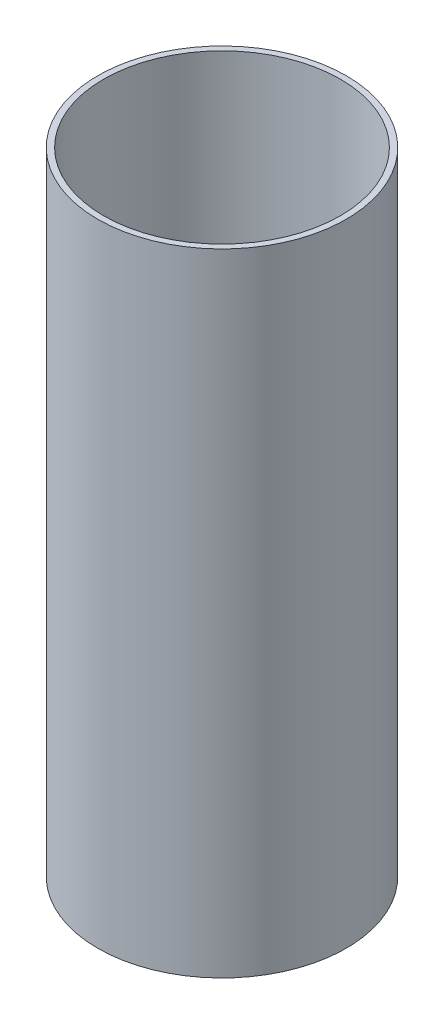
ISO-10303-21;
HEADER;
FILE_DESCRIPTION(('STEP AP214'),'2;1');
FILE_NAME('part.step','',(''),(''),'','','');
FILE_SCHEMA(('AUTOMOTIVE_DESIGN { 1 0 10303 214 1 1 1 1 }'));
ENDSEC;
DATA;
#1=APPLICATION_CONTEXT('core data for automotive mechanical design processes');
#2=APPLICATION_PROTOCOL_DEFINITION('international standard','automotive_design',2000,#1);
#3=PRODUCT_CONTEXT('',#1,'mechanical');
#4=PRODUCT('Part','Part','',(#3));
#5=PRODUCT_RELATED_PRODUCT_CATEGORY('part','',(#4));
#6=PRODUCT_DEFINITION_FORMATION('','',#4);
#7=PRODUCT_DEFINITION_CONTEXT('part definition',#1,'design');
#8=PRODUCT_DEFINITION('design','',#6,#7);
#9=PRODUCT_DEFINITION_SHAPE('','',#8);
#10=(LENGTH_UNIT() NAMED_UNIT(*) SI_UNIT(.MILLI.,.METRE.));
#11=(NAMED_UNIT(*) PLANE_ANGLE_UNIT() SI_UNIT($,.RADIAN.));
#12=(NAMED_UNIT(*) SI_UNIT($,.STERADIAN.) SOLID_ANGLE_UNIT());
#13=UNCERTAINTY_MEASURE_WITH_UNIT(LENGTH_MEASURE(1.E-05),#10,'distance_accuracy_value','');
#14=(GEOMETRIC_REPRESENTATION_CONTEXT(3) GLOBAL_UNCERTAINTY_ASSIGNED_CONTEXT((#13)) GLOBAL_UNIT_ASSIGNED_CONTEXT((#10,
#11,#12)) REPRESENTATION_CONTEXT('',''));
#15=CARTESIAN_POINT('',(0.,0.,0.));
#16=DIRECTION('',(0.,0.,1.));
#17=DIRECTION('',(1.,0.,0.));
#18=AXIS2_PLACEMENT_3D('',#15,#16,#17);
#19=CARTESIAN_POINT('',(0.,203.2,0.));
#20=DIRECTION('',(0.,1.,0.));
#21=DIRECTION('',(0.,0.,1.));
#22=AXIS2_PLACEMENT_3D('',#19,#20,#21);
#23=PLANE('',#22);
#24=CARTESIAN_POINT('',(0.,203.2,0.));
#25=DIRECTION('',(0.,1.,0.));
#26=DIRECTION('',(0.,0.,1.));
#27=AXIS2_PLACEMENT_3D('',#24,#25,#26);
#28=CIRCLE('',#27,40.005);
#29=CARTESIAN_POINT('',(0.,203.2,40.005));
#30=VERTEX_POINT('',#29);
#31=EDGE_CURVE('E10',#30,#30,#28,.T.);
#32=ORIENTED_EDGE('',*,*,#31,.T.);
#33=EDGE_LOOP('',(#32));
#34=FACE_BOUND('',#33,.T.);
#35=CARTESIAN_POINT('',(0.,203.2,0.));
#36=DIRECTION('',(0.,1.,0.));
#37=DIRECTION('',(0.,0.,1.));
#38=AXIS2_PLACEMENT_3D('',#35,#36,#37);
#39=CIRCLE('',#38,38.1);
#40=CARTESIAN_POINT('',(0.,203.2,38.1));
#41=VERTEX_POINT('',#40);
#42=EDGE_CURVE('E50',#41,#41,#39,.T.);
#43=ORIENTED_EDGE('',*,*,#42,.F.);
#44=EDGE_LOOP('',(#43));
#45=FACE_BOUND('',#44,.T.);
#46=ADVANCED_FACE('F39',(#34,#45),#23,.T.);
#47=CARTESIAN_POINT('',(0.,0.,0.));
#48=DIRECTION('',(0.,1.,0.));
#49=DIRECTION('',(0.,0.,1.));
#50=AXIS2_PLACEMENT_3D('',#47,#48,#49);
#51=PLANE('',#50);
#52=CARTESIAN_POINT('',(0.,0.,0.));
#53=DIRECTION('',(0.,1.,0.));
#54=DIRECTION('',(0.,0.,1.));
#55=AXIS2_PLACEMENT_3D('',#52,#53,#54);
#56=CIRCLE('',#55,40.005);
#57=CARTESIAN_POINT('',(0.,0.,40.005));
#58=VERTEX_POINT('',#57);
#59=EDGE_CURVE('E43',#58,#58,#56,.T.);
#60=ORIENTED_EDGE('',*,*,#59,.F.);
#61=EDGE_LOOP('',(#60));
#62=FACE_BOUND('',#61,.T.);
#63=CARTESIAN_POINT('',(0.,0.,0.));
#64=DIRECTION('',(0.,1.,0.));
#65=DIRECTION('',(0.,0.,1.));
#66=AXIS2_PLACEMENT_3D('',#63,#64,#65);
#67=CIRCLE('',#66,38.1);
#68=CARTESIAN_POINT('',(0.,0.,38.1));
#69=VERTEX_POINT('',#68);
#70=EDGE_CURVE('E52',#69,#69,#67,.T.);
#71=ORIENTED_EDGE('',*,*,#70,.T.);
#72=EDGE_LOOP('',(#71));
#73=FACE_BOUND('',#72,.T.);
#74=ADVANCED_FACE('F62',(#62,#73),#51,.F.);
#75=CARTESIAN_POINT('',(0.,203.2,0.));
#76=DIRECTION('',(0.,-1.,0.));
#77=DIRECTION('',(0.,0.,-1.));
#78=AXIS2_PLACEMENT_3D('',#75,#76,#77);
#79=CYLINDRICAL_SURFACE('',#78,40.005);
#80=ORIENTED_EDGE('',*,*,#31,.F.);
#81=EDGE_LOOP('',(#80));
#82=FACE_BOUND('',#81,.T.);
#83=ORIENTED_EDGE('',*,*,#59,.T.);
#84=EDGE_LOOP('',(#83));
#85=FACE_BOUND('',#84,.T.);
#86=ADVANCED_FACE('F41',(#82,#85),#79,.T.);
#87=CARTESIAN_POINT('',(0.,203.2,0.));
#88=DIRECTION('',(0.,-1.,0.));
#89=DIRECTION('',(0.,0.,-1.));
#90=AXIS2_PLACEMENT_3D('',#87,#88,#89);
#91=CYLINDRICAL_SURFACE('',#90,38.1);
#92=ORIENTED_EDGE('',*,*,#42,.T.);
#93=EDGE_LOOP('',(#92));
#94=FACE_BOUND('',#93,.T.);
#95=ORIENTED_EDGE('',*,*,#70,.F.);
#96=EDGE_LOOP('',(#95));
#97=FACE_BOUND('',#96,.T.);
#98=ADVANCED_FACE('F58',(#94,#97),#91,.F.);
#99=CLOSED_SHELL('',(#46,#74,#86,#98));
#100=MANIFOLD_SOLID_BREP('B2',#99);
#101=ADVANCED_BREP_SHAPE_REPRESENTATION('',(#18,#100),#14);
#102=SHAPE_DEFINITION_REPRESENTATION(#9,#101);
ENDSEC;
END-ISO-10303-21;
